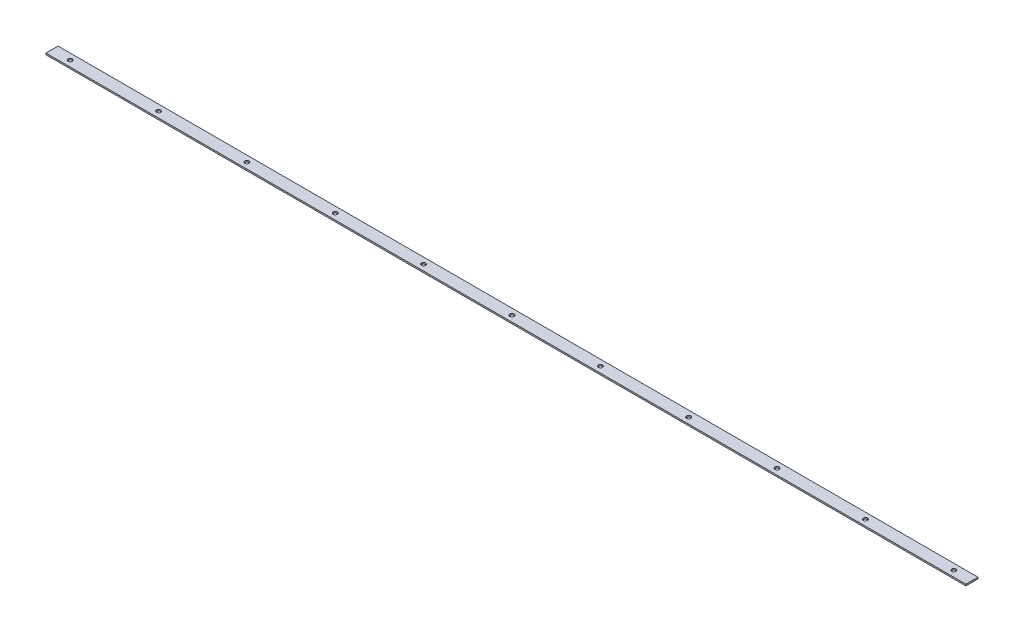
ISO-10303-21;
HEADER;
FILE_DESCRIPTION(('STEP AP214'),'2;1');
FILE_NAME('part.step','',(''),(''),'','','');
FILE_SCHEMA(('AUTOMOTIVE_DESIGN { 1 0 10303 214 1 1 1 1 }'));
ENDSEC;
DATA;
#1=APPLICATION_CONTEXT('core data for automotive mechanical design processes');
#2=APPLICATION_PROTOCOL_DEFINITION('international standard','automotive_design',2000,#1);
#3=PRODUCT_CONTEXT('',#1,'mechanical');
#4=PRODUCT('Part','Part','',(#3));
#5=PRODUCT_RELATED_PRODUCT_CATEGORY('part','',(#4));
#6=PRODUCT_DEFINITION_FORMATION('','',#4);
#7=PRODUCT_DEFINITION_CONTEXT('part definition',#1,'design');
#8=PRODUCT_DEFINITION('design','',#6,#7);
#9=PRODUCT_DEFINITION_SHAPE('','',#8);
#10=(LENGTH_UNIT() NAMED_UNIT(*) SI_UNIT(.MILLI.,.METRE.));
#11=(NAMED_UNIT(*) PLANE_ANGLE_UNIT() SI_UNIT($,.RADIAN.));
#12=(NAMED_UNIT(*) SI_UNIT($,.STERADIAN.) SOLID_ANGLE_UNIT());
#13=UNCERTAINTY_MEASURE_WITH_UNIT(LENGTH_MEASURE(1.E-05),#10,'distance_accuracy_value','');
#14=(GEOMETRIC_REPRESENTATION_CONTEXT(3) GLOBAL_UNCERTAINTY_ASSIGNED_CONTEXT((#13)) GLOBAL_UNIT_ASSIGNED_CONTEXT((#10,
#11,#12)) REPRESENTATION_CONTEXT('',''));
#15=CARTESIAN_POINT('',(0.,0.,0.));
#16=DIRECTION('',(0.,0.,1.));
#17=DIRECTION('',(1.,0.,0.));
#18=AXIS2_PLACEMENT_3D('',#15,#16,#17);
#19=CARTESIAN_POINT('',(760.000000000002,-2.49999999999972,10.0000000000002));
#20=DIRECTION('',(1.,0.,0.));
#21=DIRECTION('',(0.,0.,-1.00000000000001));
#22=AXIS2_PLACEMENT_3D('',#19,#20,#21);
#23=PLANE('',#22);
#24=DIRECTION('',(0.,0.,-1.00000000000001));
#25=VECTOR('',#24,1.);
#26=CARTESIAN_POINT('',(760.000000000002,-2.22044604925031E-13,10.0000000000002));
#27=LINE('',#26,#25);
#28=CARTESIAN_POINT('',(760.000000000002,-2.22044604925031E-13,10.0000000000002));
#29=VERTEX_POINT('',#28);
#30=CARTESIAN_POINT('',(760.000000000002,-3.33066907387547E-13,-9.99999999999986));
#31=VERTEX_POINT('',#30);
#32=EDGE_CURVE('E101',#29,#31,#27,.T.);
#33=ORIENTED_EDGE('',*,*,#32,.F.);
#34=DIRECTION('',(0.,1.00000000000001,0.));
#35=VECTOR('',#34,1.);
#36=CARTESIAN_POINT('',(760.000000000002,-2.49999999999972,10.0000000000002));
#37=LINE('',#36,#35);
#38=CARTESIAN_POINT('',(760.000000000002,-2.49999999999972,10.0000000000002));
#39=VERTEX_POINT('',#38);
#40=EDGE_CURVE('E11',#39,#29,#37,.T.);
#41=ORIENTED_EDGE('',*,*,#40,.F.);
#42=DIRECTION('',(0.,0.,-1.00000000000001));
#43=VECTOR('',#42,1.);
#44=CARTESIAN_POINT('',(760.000000000002,-2.49999999999972,10.0000000000002));
#45=LINE('',#44,#43);
#46=CARTESIAN_POINT('',(760.000000000002,-2.49999999999989,-10.0000000000001));
#47=VERTEX_POINT('',#46);
#48=EDGE_CURVE('E94',#39,#47,#45,.T.);
#49=ORIENTED_EDGE('',*,*,#48,.T.);
#50=DIRECTION('',(0.,1.00000000000001,0.));
#51=VECTOR('',#50,1.);
#52=CARTESIAN_POINT('',(760.000000000002,-2.49999999999989,-10.0000000000001));
#53=LINE('',#52,#51);
#54=EDGE_CURVE('E39',#47,#31,#53,.T.);
#55=ORIENTED_EDGE('',*,*,#54,.T.);
#56=EDGE_LOOP('',(#33,#41,#49,#55));
#57=FACE_BOUND('',#56,.T.);
#58=ADVANCED_FACE('F36',(#57),#23,.T.);
#59=CARTESIAN_POINT('',(-760.000000000005,-2.50000000000006,10.0000000000002));
#60=DIRECTION('',(0.,0.,1.00000000000001));
#61=DIRECTION('',(1.,0.,0.));
#62=AXIS2_PLACEMENT_3D('',#59,#60,#61);
#63=PLANE('',#62);
#64=DIRECTION('',(1.,0.,0.));
#65=VECTOR('',#64,1.);
#66=CARTESIAN_POINT('',(-760.000000000005,-2.22044604925031E-13,10.0000000000002));
#67=LINE('',#66,#65);
#68=CARTESIAN_POINT('',(-760.000000000005,-2.22044604925031E-13,10.0000000000002));
#69=VERTEX_POINT('',#68);
#70=EDGE_CURVE('E96',#69,#29,#67,.T.);
#71=ORIENTED_EDGE('',*,*,#70,.F.);
#72=DIRECTION('',(0.,1.00000000000001,0.));
#73=VECTOR('',#72,1.);
#74=CARTESIAN_POINT('',(-760.000000000005,-2.50000000000006,10.0000000000002));
#75=LINE('',#74,#73);
#76=CARTESIAN_POINT('',(-760.000000000005,-2.50000000000006,10.0000000000002));
#77=VERTEX_POINT('',#76);
#78=EDGE_CURVE('E45',#77,#69,#75,.T.);
#79=ORIENTED_EDGE('',*,*,#78,.F.);
#80=DIRECTION('',(1.,0.,0.));
#81=VECTOR('',#80,1.);
#82=CARTESIAN_POINT('',(-760.000000000005,-2.50000000000006,10.0000000000002));
#83=LINE('',#82,#81);
#84=EDGE_CURVE('E91',#77,#39,#83,.T.);
#85=ORIENTED_EDGE('',*,*,#84,.T.);
#86=ORIENTED_EDGE('',*,*,#40,.T.);
#87=EDGE_LOOP('',(#71,#79,#85,#86));
#88=FACE_BOUND('',#87,.T.);
#89=ADVANCED_FACE('F112',(#88),#63,.T.);
#90=CARTESIAN_POINT('',(-760.000000000005,-2.50000000000006,10.0000000000002));
#91=DIRECTION('',(-1.,0.,0.));
#92=DIRECTION('',(0.,0.,1.00000000000001));
#93=AXIS2_PLACEMENT_3D('',#90,#91,#92);
#94=PLANE('',#93);
#95=DIRECTION('',(0.,0.,1.00000000000001));
#96=VECTOR('',#95,1.);
#97=CARTESIAN_POINT('',(-760.000000000005,-2.22044604925031E-13,10.0000000000002));
#98=LINE('',#97,#96);
#99=CARTESIAN_POINT('',(-760.000000000005,-1.11022302462516E-13,-9.99999999999993));
#100=VERTEX_POINT('',#99);
#101=EDGE_CURVE('E86',#100,#69,#98,.T.);
#102=ORIENTED_EDGE('',*,*,#101,.F.);
#103=DIRECTION('',(0.,1.00000000000001,0.));
#104=VECTOR('',#103,1.);
#105=CARTESIAN_POINT('',(-760.000000000005,-2.50000000000028,-10.0000000000001));
#106=LINE('',#105,#104);
#107=CARTESIAN_POINT('',(-760.000000000005,-2.50000000000028,-10.0000000000001));
#108=VERTEX_POINT('',#107);
#109=EDGE_CURVE('E81',#108,#100,#106,.T.);
#110=ORIENTED_EDGE('',*,*,#109,.F.);
#111=DIRECTION('',(0.,0.,1.00000000000001));
#112=VECTOR('',#111,1.);
#113=CARTESIAN_POINT('',(-760.000000000005,-2.50000000000006,10.0000000000002));
#114=LINE('',#113,#112);
#115=EDGE_CURVE('E84',#108,#77,#114,.T.);
#116=ORIENTED_EDGE('',*,*,#115,.T.);
#117=ORIENTED_EDGE('',*,*,#78,.T.);
#118=EDGE_LOOP('',(#102,#110,#116,#117));
#119=FACE_BOUND('',#118,.T.);
#120=ADVANCED_FACE('F83',(#119),#94,.T.);
#121=CARTESIAN_POINT('',(-760.000000000005,-2.50000000000028,-10.0000000000001));
#122=DIRECTION('',(0.,0.,-1.00000000000001));
#123=DIRECTION('',(-1.,0.,0.));
#124=AXIS2_PLACEMENT_3D('',#121,#122,#123);
#125=PLANE('',#124);
#126=DIRECTION('',(-1.,0.,0.));
#127=VECTOR('',#126,1.);
#128=CARTESIAN_POINT('',(-760.000000000005,-1.11022302462516E-13,-9.99999999999993));
#129=LINE('',#128,#127);
#130=EDGE_CURVE('E104',#31,#100,#129,.T.);
#131=ORIENTED_EDGE('',*,*,#130,.F.);
#132=ORIENTED_EDGE('',*,*,#54,.F.);
#133=DIRECTION('',(-1.,0.,0.));
#134=VECTOR('',#133,1.);
#135=CARTESIAN_POINT('',(-760.000000000005,-2.50000000000028,-10.0000000000001));
#136=LINE('',#135,#134);
#137=EDGE_CURVE('E90',#47,#108,#136,.T.);
#138=ORIENTED_EDGE('',*,*,#137,.T.);
#139=ORIENTED_EDGE('',*,*,#109,.T.);
#140=EDGE_LOOP('',(#131,#132,#138,#139));
#141=FACE_BOUND('',#140,.T.);
#142=ADVANCED_FACE('F93',(#141),#125,.T.);
#143=CARTESIAN_POINT('',(0.,-2.50000000000011,2.35922392732846E-13));
#144=DIRECTION('',(0.,-1.00000000000001,0.));
#145=DIRECTION('',(0.,0.,-1.00000000000001));
#146=AXIS2_PLACEMENT_3D('',#143,#144,#145);
#147=PLANE('',#146);
#148=CARTESIAN_POINT('',(730.,-2.5,0.));
#149=DIRECTION('',(0.,-1.00000000000001,0.));
#150=DIRECTION('',(0.,0.,-1.00000000000001));
#151=AXIS2_PLACEMENT_3D('',#148,#149,#150);
#152=CIRCLE('',#151,3.5);
#153=CARTESIAN_POINT('',(730.,-2.5,-3.50000000000006));
#154=VERTEX_POINT('',#153);
#155=EDGE_CURVE('E237',#154,#154,#152,.T.);
#156=ORIENTED_EDGE('',*,*,#155,.F.);
#157=EDGE_LOOP('',(#156));
#158=FACE_BOUND('',#157,.T.);
#159=CARTESIAN_POINT('',(584.,-2.50000000000006,1.94289029309402E-13));
#160=DIRECTION('',(0.,-1.00000000000001,0.));
#161=DIRECTION('',(0.,0.,-1.00000000000001));
#162=AXIS2_PLACEMENT_3D('',#159,#160,#161);
#163=CIRCLE('',#162,3.5);
#164=CARTESIAN_POINT('',(584.,-2.50000000000006,-3.49999999999984));
#165=VERTEX_POINT('',#164);
#166=EDGE_CURVE('E231',#165,#165,#163,.T.);
#167=ORIENTED_EDGE('',*,*,#166,.F.);
#168=EDGE_LOOP('',(#167));
#169=FACE_BOUND('',#168,.T.);
#170=CARTESIAN_POINT('',(438.000000000002,-2.50000000000006,3.7470027081099E-13));
#171=DIRECTION('',(0.,-1.00000000000001,0.));
#172=DIRECTION('',(0.,0.,-1.00000000000001));
#173=AXIS2_PLACEMENT_3D('',#170,#171,#172);
#174=CIRCLE('',#173,3.5);
#175=CARTESIAN_POINT('',(438.000000000002,-2.50000000000006,-3.49999999999966));
#176=VERTEX_POINT('',#175);
#177=EDGE_CURVE('E225',#176,#176,#174,.T.);
#178=ORIENTED_EDGE('',*,*,#177,.F.);
#179=EDGE_LOOP('',(#178));
#180=FACE_BOUND('',#179,.T.);
#181=CARTESIAN_POINT('',(292.000000000002,-2.50000000000017,-1.38777878078145E-13));
#182=DIRECTION('',(0.,-1.00000000000001,0.));
#183=DIRECTION('',(0.,0.,-1.00000000000001));
#184=AXIS2_PLACEMENT_3D('',#181,#182,#183);
#185=CIRCLE('',#184,3.5);
#186=CARTESIAN_POINT('',(292.000000000002,-2.50000000000017,-3.50000000000017));
#187=VERTEX_POINT('',#186);
#188=EDGE_CURVE('E219',#187,#187,#185,.T.);
#189=ORIENTED_EDGE('',*,*,#188,.F.);
#190=EDGE_LOOP('',(#189));
#191=FACE_BOUND('',#190,.T.);
#192=CARTESIAN_POINT('',(146.,-2.50000000000017,0.));
#193=DIRECTION('',(0.,-1.00000000000001,0.));
#194=DIRECTION('',(0.,0.,-1.00000000000001));
#195=AXIS2_PLACEMENT_3D('',#192,#193,#194);
#196=CIRCLE('',#195,3.5);
#197=CARTESIAN_POINT('',(146.,-2.50000000000017,-3.50000000000009));
#198=VERTEX_POINT('',#197);
#199=EDGE_CURVE('E213',#198,#198,#196,.T.);
#200=ORIENTED_EDGE('',*,*,#199,.F.);
#201=EDGE_LOOP('',(#200));
#202=FACE_BOUND('',#201,.T.);
#203=CARTESIAN_POINT('',(-730.000000000003,-2.50000000000017,0.));
#204=DIRECTION('',(0.,-1.00000000000001,0.));
#205=DIRECTION('',(0.,0.,-1.00000000000001));
#206=AXIS2_PLACEMENT_3D('',#203,#204,#205);
#207=CIRCLE('',#206,3.5);
#208=CARTESIAN_POINT('',(-730.000000000003,-2.50000000000017,-3.50000000000005));
#209=VERTEX_POINT('',#208);
#210=EDGE_CURVE('E207',#209,#209,#207,.T.);
#211=ORIENTED_EDGE('',*,*,#210,.F.);
#212=EDGE_LOOP('',(#211));
#213=FACE_BOUND('',#212,.T.);
#214=CARTESIAN_POINT('',(-584.000000000003,-2.5,0.));
#215=DIRECTION('',(0.,-1.00000000000001,0.));
#216=DIRECTION('',(0.,0.,-1.00000000000001));
#217=AXIS2_PLACEMENT_3D('',#214,#215,#216);
#218=CIRCLE('',#217,3.5);
#219=CARTESIAN_POINT('',(-584.000000000003,-2.5,-3.50000000000013));
#220=VERTEX_POINT('',#219);
#221=EDGE_CURVE('E201',#220,#220,#218,.T.);
#222=ORIENTED_EDGE('',*,*,#221,.F.);
#223=EDGE_LOOP('',(#222));
#224=FACE_BOUND('',#223,.T.);
#225=CARTESIAN_POINT('',(-438.000000000001,-2.49999999999972,0.));
#226=DIRECTION('',(0.,-1.00000000000001,0.));
#227=DIRECTION('',(0.,0.,-1.00000000000001));
#228=AXIS2_PLACEMENT_3D('',#225,#226,#227);
#229=CIRCLE('',#228,3.5);
#230=CARTESIAN_POINT('',(-438.000000000001,-2.49999999999972,-3.50000000000011));
#231=VERTEX_POINT('',#230);
#232=EDGE_CURVE('E195',#231,#231,#229,.T.);
#233=ORIENTED_EDGE('',*,*,#232,.F.);
#234=EDGE_LOOP('',(#233));
#235=FACE_BOUND('',#234,.T.);
#236=CARTESIAN_POINT('',(-292.,-2.50000000000022,-3.33066907387547E-13));
#237=DIRECTION('',(0.,-1.00000000000001,0.));
#238=DIRECTION('',(0.,0.,-1.00000000000001));
#239=AXIS2_PLACEMENT_3D('',#236,#237,#238);
#240=CIRCLE('',#239,3.5);
#241=CARTESIAN_POINT('',(-292.,-2.50000000000022,-3.50000000000036));
#242=VERTEX_POINT('',#241);
#243=EDGE_CURVE('E182',#242,#242,#240,.T.);
#244=ORIENTED_EDGE('',*,*,#243,.F.);
#245=EDGE_LOOP('',(#244));
#246=FACE_BOUND('',#245,.T.);
#247=CARTESIAN_POINT('',(-146.000000000001,-2.50000000000056,0.));
#248=DIRECTION('',(0.,-1.00000000000001,0.));
#249=DIRECTION('',(0.,0.,-1.00000000000001));
#250=AXIS2_PLACEMENT_3D('',#247,#248,#249);
#251=CIRCLE('',#250,3.5);
#252=CARTESIAN_POINT('',(-146.000000000001,-2.50000000000056,-3.49999999999995));
#253=VERTEX_POINT('',#252);
#254=EDGE_CURVE('E187',#253,#253,#251,.T.);
#255=ORIENTED_EDGE('',*,*,#254,.F.);
#256=EDGE_LOOP('',(#255));
#257=FACE_BOUND('',#256,.T.);
#258=CARTESIAN_POINT('',(0.,-2.50000000000011,2.35922392732846E-13));
#259=DIRECTION('',(0.,-1.00000000000001,0.));
#260=DIRECTION('',(0.,0.,-1.00000000000001));
#261=AXIS2_PLACEMENT_3D('',#258,#259,#260);
#262=CIRCLE('',#261,3.5);
#263=CARTESIAN_POINT('',(0.,-2.50000000000011,-3.4999999999998));
#264=VERTEX_POINT('',#263);
#265=EDGE_CURVE('E105',#264,#264,#262,.T.);
#266=ORIENTED_EDGE('',*,*,#265,.F.);
#267=EDGE_LOOP('',(#266));
#268=FACE_BOUND('',#267,.T.);
#269=ORIENTED_EDGE('',*,*,#48,.F.);
#270=ORIENTED_EDGE('',*,*,#84,.F.);
#271=ORIENTED_EDGE('',*,*,#115,.F.);
#272=ORIENTED_EDGE('',*,*,#137,.F.);
#273=EDGE_LOOP('',(#269,#270,#271,#272));
#274=FACE_BOUND('',#273,.T.);
#275=ADVANCED_FACE('F89',(#158,#169,#180,#191,#202,#213,#224,#235,#246,#257,#268,#274),#147,.T.);
#276=CARTESIAN_POINT('',(0.,0.,0.));
#277=DIRECTION('',(0.,-1.00000000000001,0.));
#278=DIRECTION('',(0.,0.,-1.00000000000001));
#279=AXIS2_PLACEMENT_3D('',#276,#277,#278);
#280=PLANE('',#279);
#281=CARTESIAN_POINT('',(730.,-1.66533453693773E-13,2.77555756156289E-13));
#282=DIRECTION('',(0.,1.00000000000001,0.));
#283=DIRECTION('',(0.,0.,1.00000000000001));
#284=AXIS2_PLACEMENT_3D('',#281,#282,#283);
#285=CIRCLE('',#284,3.5);
#286=CARTESIAN_POINT('',(730.,-1.66339164664464E-13,3.50000000000031));
#287=VERTEX_POINT('',#286);
#288=EDGE_CURVE('E234',#287,#287,#285,.T.);
#289=ORIENTED_EDGE('',*,*,#288,.F.);
#290=EDGE_LOOP('',(#289));
#291=FACE_BOUND('',#290,.T.);
#292=CARTESIAN_POINT('',(584.,-2.77555756156289E-13,2.4980018054066E-13));
#293=DIRECTION('',(0.,1.00000000000001,0.));
#294=DIRECTION('',(0.,0.,1.00000000000001));
#295=AXIS2_PLACEMENT_3D('',#292,#293,#294);
#296=CIRCLE('',#295,3.5);
#297=CARTESIAN_POINT('',(584.,-2.7736146712698E-13,3.50000000000028));
#298=VERTEX_POINT('',#297);
#299=EDGE_CURVE('E228',#298,#298,#296,.T.);
#300=ORIENTED_EDGE('',*,*,#299,.F.);
#301=EDGE_LOOP('',(#300));
#302=FACE_BOUND('',#301,.T.);
#303=CARTESIAN_POINT('',(438.000000000002,1.66533453693773E-13,3.05311331771918E-13));
#304=DIRECTION('',(0.,1.00000000000001,0.));
#305=DIRECTION('',(0.,0.,1.00000000000001));
#306=AXIS2_PLACEMENT_3D('',#303,#304,#305);
#307=CIRCLE('',#306,3.5);
#308=CARTESIAN_POINT('',(438.000000000002,1.66727742723083E-13,3.50000000000034));
#309=VERTEX_POINT('',#308);
#310=EDGE_CURVE('E222',#309,#309,#307,.T.);
#311=ORIENTED_EDGE('',*,*,#310,.F.);
#312=EDGE_LOOP('',(#311));
#313=FACE_BOUND('',#312,.T.);
#314=CARTESIAN_POINT('',(292.000000000002,1.11022302462516E-13,0.));
#315=DIRECTION('',(0.,1.00000000000001,0.));
#316=DIRECTION('',(0.,0.,1.00000000000001));
#317=AXIS2_PLACEMENT_3D('',#314,#315,#316);
#318=CIRCLE('',#317,3.5);
#319=CARTESIAN_POINT('',(292.000000000002,1.11216591491825E-13,3.49999999999995));
#320=VERTEX_POINT('',#319);
#321=EDGE_CURVE('E216',#320,#320,#318,.T.);
#322=ORIENTED_EDGE('',*,*,#321,.F.);
#323=EDGE_LOOP('',(#322));
#324=FACE_BOUND('',#323,.T.);
#325=CARTESIAN_POINT('',(146.,4.44089209850063E-13,0.));
#326=DIRECTION('',(0.,1.00000000000001,0.));
#327=DIRECTION('',(0.,0.,1.00000000000001));
#328=AXIS2_PLACEMENT_3D('',#325,#326,#327);
#329=CIRCLE('',#328,3.5);
#330=CARTESIAN_POINT('',(146.,4.44283498879372E-13,3.50000000000006));
#331=VERTEX_POINT('',#330);
#332=EDGE_CURVE('E210',#331,#331,#329,.T.);
#333=ORIENTED_EDGE('',*,*,#332,.F.);
#334=EDGE_LOOP('',(#333));
#335=FACE_BOUND('',#334,.T.);
#336=CARTESIAN_POINT('',(-730.000000000003,-2.77555756156289E-13,1.80411241501588E-13));
#337=DIRECTION('',(0.,1.00000000000001,0.));
#338=DIRECTION('',(0.,0.,1.00000000000001));
#339=AXIS2_PLACEMENT_3D('',#336,#337,#338);
#340=CIRCLE('',#339,3.5);
#341=CARTESIAN_POINT('',(-730.000000000003,-2.7736146712698E-13,3.50000000000021));
#342=VERTEX_POINT('',#341);
#343=EDGE_CURVE('E204',#342,#342,#340,.T.);
#344=ORIENTED_EDGE('',*,*,#343,.F.);
#345=EDGE_LOOP('',(#344));
#346=FACE_BOUND('',#345,.T.);
#347=CARTESIAN_POINT('',(-584.000000000003,-1.11022302462516E-13,0.));
#348=DIRECTION('',(0.,1.00000000000001,0.));
#349=DIRECTION('',(0.,0.,1.00000000000001));
#350=AXIS2_PLACEMENT_3D('',#347,#348,#349);
#351=CIRCLE('',#350,3.5);
#352=CARTESIAN_POINT('',(-584.000000000003,-1.10828013433206E-13,3.50000000000009));
#353=VERTEX_POINT('',#352);
#354=EDGE_CURVE('E198',#353,#353,#351,.T.);
#355=ORIENTED_EDGE('',*,*,#354,.F.);
#356=EDGE_LOOP('',(#355));
#357=FACE_BOUND('',#356,.T.);
#358=CARTESIAN_POINT('',(-438.000000000001,-4.44089209850063E-13,-1.94289029309402E-13));
#359=DIRECTION('',(0.,1.00000000000001,0.));
#360=DIRECTION('',(0.,0.,1.00000000000001));
#361=AXIS2_PLACEMENT_3D('',#358,#359,#360);
#362=CIRCLE('',#361,3.5);
#363=CARTESIAN_POINT('',(-438.000000000001,-4.43894920820753E-13,3.49999999999984));
#364=VERTEX_POINT('',#363);
#365=EDGE_CURVE('E192',#364,#364,#362,.T.);
#366=ORIENTED_EDGE('',*,*,#365,.F.);
#367=EDGE_LOOP('',(#366));
#368=FACE_BOUND('',#367,.T.);
#369=CARTESIAN_POINT('',(-292.,-1.11022302462516E-13,0.));
#370=DIRECTION('',(0.,1.00000000000001,0.));
#371=DIRECTION('',(0.,0.,1.00000000000001));
#372=AXIS2_PLACEMENT_3D('',#369,#370,#371);
#373=CIRCLE('',#372,3.5);
#374=CARTESIAN_POINT('',(-292.,-1.10828013433206E-13,3.50000000000005));
#375=VERTEX_POINT('',#374);
#376=EDGE_CURVE('E185',#375,#375,#373,.T.);
#377=ORIENTED_EDGE('',*,*,#376,.F.);
#378=EDGE_LOOP('',(#377));
#379=FACE_BOUND('',#378,.T.);
#380=CARTESIAN_POINT('',(-146.000000000001,-1.11022302462516E-13,0.));
#381=DIRECTION('',(0.,1.00000000000001,0.));
#382=DIRECTION('',(0.,0.,1.00000000000001));
#383=AXIS2_PLACEMENT_3D('',#380,#381,#382);
#384=CIRCLE('',#383,3.5);
#385=CARTESIAN_POINT('',(-146.000000000001,-1.10828013433206E-13,3.50000000000007));
#386=VERTEX_POINT('',#385);
#387=EDGE_CURVE('E190',#386,#386,#384,.T.);
#388=ORIENTED_EDGE('',*,*,#387,.F.);
#389=EDGE_LOOP('',(#388));
#390=FACE_BOUND('',#389,.T.);
#391=CARTESIAN_POINT('',(0.,0.,0.));
#392=DIRECTION('',(0.,1.00000000000001,0.));
#393=DIRECTION('',(0.,0.,1.00000000000001));
#394=AXIS2_PLACEMENT_3D('',#391,#392,#393);
#395=CIRCLE('',#394,3.5);
#396=CARTESIAN_POINT('',(0.,0.,3.50000000000003));
#397=VERTEX_POINT('',#396);
#398=EDGE_CURVE('E244',#397,#397,#395,.T.);
#399=ORIENTED_EDGE('',*,*,#398,.F.);
#400=EDGE_LOOP('',(#399));
#401=FACE_BOUND('',#400,.T.);
#402=ORIENTED_EDGE('',*,*,#32,.T.);
#403=ORIENTED_EDGE('',*,*,#130,.T.);
#404=ORIENTED_EDGE('',*,*,#101,.T.);
#405=ORIENTED_EDGE('',*,*,#70,.T.);
#406=EDGE_LOOP('',(#402,#403,#404,#405));
#407=FACE_BOUND('',#406,.T.);
#408=ADVANCED_FACE('F111',(#291,#302,#313,#324,#335,#346,#357,#368,#379,#390,#401,#407),#280,.F.);
#409=CARTESIAN_POINT('',(0.,-10.0000000000004,0.));
#410=DIRECTION('',(0.,1.00000000000001,0.));
#411=DIRECTION('',(0.,0.,1.00000000000001));
#412=AXIS2_PLACEMENT_3D('',#409,#410,#411);
#413=CYLINDRICAL_SURFACE('',#412,3.5);
#414=ORIENTED_EDGE('',*,*,#265,.T.);
#415=EDGE_LOOP('',(#414));
#416=FACE_BOUND('',#415,.T.);
#417=ORIENTED_EDGE('',*,*,#398,.T.);
#418=EDGE_LOOP('',(#417));
#419=FACE_BOUND('',#418,.T.);
#420=ADVANCED_FACE('F130',(#416,#419),#413,.F.);
#421=CARTESIAN_POINT('',(-146.,-10.0000000000002,-2.35922392732846E-13));
#422=DIRECTION('',(0.,1.00000000000001,0.));
#423=DIRECTION('',(0.,0.,1.00000000000001));
#424=AXIS2_PLACEMENT_3D('',#421,#422,#423);
#425=CYLINDRICAL_SURFACE('',#424,3.5);
#426=ORIENTED_EDGE('',*,*,#254,.T.);
#427=EDGE_LOOP('',(#426));
#428=FACE_BOUND('',#427,.T.);
#429=ORIENTED_EDGE('',*,*,#387,.T.);
#430=EDGE_LOOP('',(#429));
#431=FACE_BOUND('',#430,.T.);
#432=ADVANCED_FACE('F137',(#428,#431),#425,.F.);
#433=CARTESIAN_POINT('',(-292.,-9.99999999999995,-3.05311331771918E-13));
#434=DIRECTION('',(0.,1.00000000000001,0.));
#435=DIRECTION('',(0.,0.,1.00000000000001));
#436=AXIS2_PLACEMENT_3D('',#433,#434,#435);
#437=CYLINDRICAL_SURFACE('',#436,3.5);
#438=ORIENTED_EDGE('',*,*,#243,.T.);
#439=EDGE_LOOP('',(#438));
#440=FACE_BOUND('',#439,.T.);
#441=ORIENTED_EDGE('',*,*,#376,.T.);
#442=EDGE_LOOP('',(#441));
#443=FACE_BOUND('',#442,.T.);
#444=ADVANCED_FACE('F141',(#440,#443),#437,.F.);
#445=CARTESIAN_POINT('',(-438.000000000001,-10.0000000000002,-3.60822483003176E-13));
#446=DIRECTION('',(0.,1.00000000000001,0.));
#447=DIRECTION('',(0.,0.,1.00000000000001));
#448=AXIS2_PLACEMENT_3D('',#445,#446,#447);
#449=CYLINDRICAL_SURFACE('',#448,3.5);
#450=ORIENTED_EDGE('',*,*,#232,.T.);
#451=EDGE_LOOP('',(#450));
#452=FACE_BOUND('',#451,.T.);
#453=ORIENTED_EDGE('',*,*,#365,.T.);
#454=EDGE_LOOP('',(#453));
#455=FACE_BOUND('',#454,.T.);
#456=ADVANCED_FACE('F170',(#452,#455),#449,.F.);
#457=CARTESIAN_POINT('',(-584.000000000003,-10.0000000000001,0.));
#458=DIRECTION('',(0.,1.00000000000001,0.));
#459=DIRECTION('',(0.,0.,1.00000000000001));
#460=AXIS2_PLACEMENT_3D('',#457,#458,#459);
#461=CYLINDRICAL_SURFACE('',#460,3.5);
#462=ORIENTED_EDGE('',*,*,#221,.T.);
#463=EDGE_LOOP('',(#462));
#464=FACE_BOUND('',#463,.T.);
#465=ORIENTED_EDGE('',*,*,#354,.T.);
#466=EDGE_LOOP('',(#465));
#467=FACE_BOUND('',#466,.T.);
#468=ADVANCED_FACE('F166',(#464,#467),#461,.F.);
#469=CARTESIAN_POINT('',(-730.000000000003,-10.,-1.2490009027033E-13));
#470=DIRECTION('',(0.,1.00000000000001,0.));
#471=DIRECTION('',(0.,0.,1.00000000000001));
#472=AXIS2_PLACEMENT_3D('',#469,#470,#471);
#473=CYLINDRICAL_SURFACE('',#472,3.5);
#474=ORIENTED_EDGE('',*,*,#210,.T.);
#475=EDGE_LOOP('',(#474));
#476=FACE_BOUND('',#475,.T.);
#477=ORIENTED_EDGE('',*,*,#343,.T.);
#478=EDGE_LOOP('',(#477));
#479=FACE_BOUND('',#478,.T.);
#480=ADVANCED_FACE('F162',(#476,#479),#473,.F.);
#481=CARTESIAN_POINT('',(146.,-9.99999999999968,0.));
#482=DIRECTION('',(0.,1.00000000000001,0.));
#483=DIRECTION('',(0.,0.,1.00000000000001));
#484=AXIS2_PLACEMENT_3D('',#481,#482,#483);
#485=CYLINDRICAL_SURFACE('',#484,3.5);
#486=ORIENTED_EDGE('',*,*,#199,.T.);
#487=EDGE_LOOP('',(#486));
#488=FACE_BOUND('',#487,.T.);
#489=ORIENTED_EDGE('',*,*,#332,.T.);
#490=EDGE_LOOP('',(#489));
#491=FACE_BOUND('',#490,.T.);
#492=ADVANCED_FACE('F158',(#488,#491),#485,.F.);
#493=CARTESIAN_POINT('',(292.000000000002,-10.0000000000004,-1.66533453693773E-13));
#494=DIRECTION('',(0.,1.00000000000001,0.));
#495=DIRECTION('',(0.,0.,1.00000000000001));
#496=AXIS2_PLACEMENT_3D('',#493,#494,#495);
#497=CYLINDRICAL_SURFACE('',#496,3.5);
#498=ORIENTED_EDGE('',*,*,#188,.T.);
#499=EDGE_LOOP('',(#498));
#500=FACE_BOUND('',#499,.T.);
#501=ORIENTED_EDGE('',*,*,#321,.T.);
#502=EDGE_LOOP('',(#501));
#503=FACE_BOUND('',#502,.T.);
#504=ADVANCED_FACE('F154',(#500,#503),#497,.F.);
#505=CARTESIAN_POINT('',(438.000000000003,-10.0000000000002,-2.4980018054066E-13));
#506=DIRECTION('',(0.,1.00000000000001,0.));
#507=DIRECTION('',(0.,0.,1.00000000000001));
#508=AXIS2_PLACEMENT_3D('',#505,#506,#507);
#509=CYLINDRICAL_SURFACE('',#508,3.5);
#510=ORIENTED_EDGE('',*,*,#177,.T.);
#511=EDGE_LOOP('',(#510));
#512=FACE_BOUND('',#511,.T.);
#513=ORIENTED_EDGE('',*,*,#310,.T.);
#514=EDGE_LOOP('',(#513));
#515=FACE_BOUND('',#514,.T.);
#516=ADVANCED_FACE('F150',(#512,#515),#509,.F.);
#517=CARTESIAN_POINT('',(584.,-10.0000000000001,2.22044604925031E-13));
#518=DIRECTION('',(0.,1.00000000000001,0.));
#519=DIRECTION('',(0.,0.,1.00000000000001));
#520=AXIS2_PLACEMENT_3D('',#517,#518,#519);
#521=CYLINDRICAL_SURFACE('',#520,3.5);
#522=ORIENTED_EDGE('',*,*,#166,.T.);
#523=EDGE_LOOP('',(#522));
#524=FACE_BOUND('',#523,.T.);
#525=ORIENTED_EDGE('',*,*,#299,.T.);
#526=EDGE_LOOP('',(#525));
#527=FACE_BOUND('',#526,.T.);
#528=ADVANCED_FACE('F146',(#524,#527),#521,.F.);
#529=CARTESIAN_POINT('',(730.,-10.0000000000002,0.));
#530=DIRECTION('',(0.,1.00000000000001,0.));
#531=DIRECTION('',(0.,0.,1.00000000000001));
#532=AXIS2_PLACEMENT_3D('',#529,#530,#531);
#533=CYLINDRICAL_SURFACE('',#532,3.5);
#534=ORIENTED_EDGE('',*,*,#155,.T.);
#535=EDGE_LOOP('',(#534));
#536=FACE_BOUND('',#535,.T.);
#537=ORIENTED_EDGE('',*,*,#288,.T.);
#538=EDGE_LOOP('',(#537));
#539=FACE_BOUND('',#538,.T.);
#540=ADVANCED_FACE('F143',(#536,#539),#533,.F.);
#541=CLOSED_SHELL('',(#58,#89,#120,#142,#275,#408,#420,#432,#444,#456,#468,#480,#492,#504,#516,
#528,#540));
#542=MANIFOLD_SOLID_BREP('B2',#541);
#543=ADVANCED_BREP_SHAPE_REPRESENTATION('',(#18,#542),#14);
#544=SHAPE_DEFINITION_REPRESENTATION(#9,#543);
ENDSEC;
END-ISO-10303-21;
